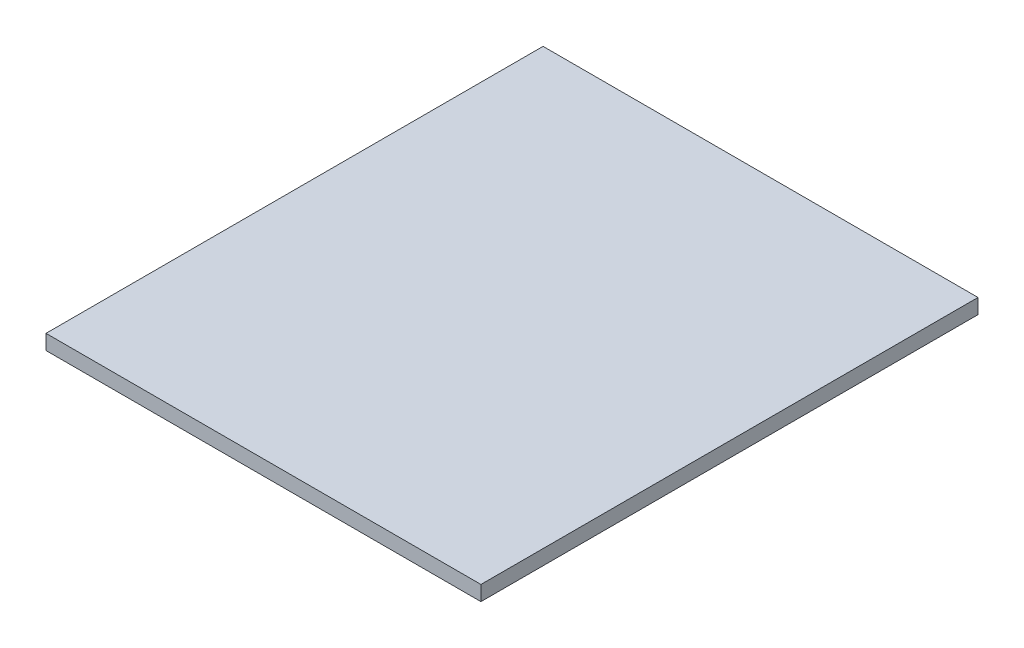
ISO-10303-21;
HEADER;
FILE_DESCRIPTION(('STEP AP214'),'2;1');
FILE_NAME('part.step','',(''),(''),'','','');
FILE_SCHEMA(('AUTOMOTIVE_DESIGN { 1 0 10303 214 1 1 1 1 }'));
ENDSEC;
DATA;
#1=APPLICATION_CONTEXT('core data for automotive mechanical design processes');
#2=APPLICATION_PROTOCOL_DEFINITION('international standard','automotive_design',2000,#1);
#3=PRODUCT_CONTEXT('',#1,'mechanical');
#4=PRODUCT('Part','Part','',(#3));
#5=PRODUCT_RELATED_PRODUCT_CATEGORY('part','',(#4));
#6=PRODUCT_DEFINITION_FORMATION('','',#4);
#7=PRODUCT_DEFINITION_CONTEXT('part definition',#1,'design');
#8=PRODUCT_DEFINITION('design','',#6,#7);
#9=PRODUCT_DEFINITION_SHAPE('','',#8);
#10=(LENGTH_UNIT() NAMED_UNIT(*) SI_UNIT(.MILLI.,.METRE.));
#11=(NAMED_UNIT(*) PLANE_ANGLE_UNIT() SI_UNIT($,.RADIAN.));
#12=(NAMED_UNIT(*) SI_UNIT($,.STERADIAN.) SOLID_ANGLE_UNIT());
#13=UNCERTAINTY_MEASURE_WITH_UNIT(LENGTH_MEASURE(1.E-05),#10,'distance_accuracy_value','');
#14=(GEOMETRIC_REPRESENTATION_CONTEXT(3) GLOBAL_UNCERTAINTY_ASSIGNED_CONTEXT((#13)) GLOBAL_UNIT_ASSIGNED_CONTEXT((#10,
#11,#12)) REPRESENTATION_CONTEXT('',''));
#15=CARTESIAN_POINT('',(0.,0.,0.));
#16=DIRECTION('',(0.,0.,1.));
#17=DIRECTION('',(1.,0.,0.));
#18=AXIS2_PLACEMENT_3D('',#15,#16,#17);
#19=CARTESIAN_POINT('',(-61.2411581593194,24.,-49.6837161639598));
#20=DIRECTION('',(1.,0.,0.));
#21=DIRECTION('',(0.,0.,-1.));
#22=AXIS2_PLACEMENT_3D('',#19,#20,#21);
#23=PLANE('',#22);
#24=DIRECTION('',(0.,0.,1.));
#25=VECTOR('',#24,1.);
#26=CARTESIAN_POINT('',(-61.2411581593194,0.,-49.6837161639598));
#27=LINE('',#26,#25);
#28=CARTESIAN_POINT('',(-61.2411581593194,0.,-49.6837161639598));
#29=VERTEX_POINT('',#28);
#30=CARTESIAN_POINT('',(-61.2411581593193,0.,750.31628383604));
#31=VERTEX_POINT('',#30);
#32=EDGE_CURVE('E95',#29,#31,#27,.T.);
#33=ORIENTED_EDGE('',*,*,#32,.T.);
#34=DIRECTION('',(0.,-1.,0.));
#35=VECTOR('',#34,1.);
#36=CARTESIAN_POINT('',(-61.2411581593193,24.,750.31628383604));
#37=LINE('',#36,#35);
#38=CARTESIAN_POINT('',(-61.2411581593193,24.,750.31628383604));
#39=VERTEX_POINT('',#38);
#40=EDGE_CURVE('E11',#39,#31,#37,.T.);
#41=ORIENTED_EDGE('',*,*,#40,.F.);
#42=DIRECTION('',(0.,0.,1.));
#43=VECTOR('',#42,1.);
#44=CARTESIAN_POINT('',(-61.2411581593194,24.,-49.6837161639598));
#45=LINE('',#44,#43);
#46=CARTESIAN_POINT('',(-61.2411581593194,24.,-49.6837161639598));
#47=VERTEX_POINT('',#46);
#48=EDGE_CURVE('E83',#47,#39,#45,.T.);
#49=ORIENTED_EDGE('',*,*,#48,.F.);
#50=DIRECTION('',(0.,-1.,0.));
#51=VECTOR('',#50,1.);
#52=CARTESIAN_POINT('',(-61.2411581593194,24.,-49.6837161639598));
#53=LINE('',#52,#51);
#54=EDGE_CURVE('E91',#47,#29,#53,.T.);
#55=ORIENTED_EDGE('',*,*,#54,.T.);
#56=EDGE_LOOP('',(#33,#41,#49,#55));
#57=FACE_BOUND('',#56,.T.);
#58=ADVANCED_FACE('F32',(#57),#23,.F.);
#59=CARTESIAN_POINT('',(-61.2411581593193,24.,750.31628383604));
#60=DIRECTION('',(0.,0.,-1.));
#61=DIRECTION('',(-1.,0.,0.));
#62=AXIS2_PLACEMENT_3D('',#59,#60,#61);
#63=PLANE('',#62);
#64=DIRECTION('',(1.,0.,0.));
#65=VECTOR('',#64,1.);
#66=CARTESIAN_POINT('',(-61.2411581593193,0.,750.31628383604));
#67=LINE('',#66,#65);
#68=CARTESIAN_POINT('',(638.758841840681,0.,750.31628383604));
#69=VERTEX_POINT('',#68);
#70=EDGE_CURVE('E87',#31,#69,#67,.T.);
#71=ORIENTED_EDGE('',*,*,#70,.T.);
#72=DIRECTION('',(0.,-1.,0.));
#73=VECTOR('',#72,1.);
#74=CARTESIAN_POINT('',(638.758841840681,24.,750.31628383604));
#75=LINE('',#74,#73);
#76=CARTESIAN_POINT('',(638.758841840681,24.,750.31628383604));
#77=VERTEX_POINT('',#76);
#78=EDGE_CURVE('E40',#77,#69,#75,.T.);
#79=ORIENTED_EDGE('',*,*,#78,.F.);
#80=DIRECTION('',(1.,0.,0.));
#81=VECTOR('',#80,1.);
#82=CARTESIAN_POINT('',(-61.2411581593193,24.,750.31628383604));
#83=LINE('',#82,#81);
#84=EDGE_CURVE('E78',#39,#77,#83,.T.);
#85=ORIENTED_EDGE('',*,*,#84,.F.);
#86=ORIENTED_EDGE('',*,*,#40,.T.);
#87=EDGE_LOOP('',(#71,#79,#85,#86));
#88=FACE_BOUND('',#87,.T.);
#89=ADVANCED_FACE('F86',(#88),#63,.F.);
#90=CARTESIAN_POINT('',(638.758841840681,24.,-49.6837161639598));
#91=DIRECTION('',(-1.,0.,0.));
#92=DIRECTION('',(0.,0.,1.));
#93=AXIS2_PLACEMENT_3D('',#90,#91,#92);
#94=PLANE('',#93);
#95=DIRECTION('',(0.,0.,-1.));
#96=VECTOR('',#95,1.);
#97=CARTESIAN_POINT('',(638.758841840681,0.,-49.6837161639598));
#98=LINE('',#97,#96);
#99=CARTESIAN_POINT('',(638.758841840681,0.,-49.6837161639598));
#100=VERTEX_POINT('',#99);
#101=EDGE_CURVE('E65',#69,#100,#98,.T.);
#102=ORIENTED_EDGE('',*,*,#101,.T.);
#103=DIRECTION('',(0.,-1.,0.));
#104=VECTOR('',#103,1.);
#105=CARTESIAN_POINT('',(638.758841840681,24.,-49.6837161639598));
#106=LINE('',#105,#104);
#107=CARTESIAN_POINT('',(638.758841840681,24.,-49.6837161639598));
#108=VERTEX_POINT('',#107);
#109=EDGE_CURVE('E88',#108,#100,#106,.T.);
#110=ORIENTED_EDGE('',*,*,#109,.F.);
#111=DIRECTION('',(0.,0.,-1.));
#112=VECTOR('',#111,1.);
#113=CARTESIAN_POINT('',(638.758841840681,24.,-49.6837161639598));
#114=LINE('',#113,#112);
#115=EDGE_CURVE('E81',#77,#108,#114,.T.);
#116=ORIENTED_EDGE('',*,*,#115,.F.);
#117=ORIENTED_EDGE('',*,*,#78,.T.);
#118=EDGE_LOOP('',(#102,#110,#116,#117));
#119=FACE_BOUND('',#118,.T.);
#120=ADVANCED_FACE('F89',(#119),#94,.F.);
#121=CARTESIAN_POINT('',(-61.2411581593194,24.,-49.6837161639598));
#122=DIRECTION('',(0.,0.,1.));
#123=DIRECTION('',(1.,0.,0.));
#124=AXIS2_PLACEMENT_3D('',#121,#122,#123);
#125=PLANE('',#124);
#126=DIRECTION('',(-1.,0.,0.));
#127=VECTOR('',#126,1.);
#128=CARTESIAN_POINT('',(-61.2411581593194,0.,-49.6837161639598));
#129=LINE('',#128,#127);
#130=EDGE_CURVE('E71',#100,#29,#129,.T.);
#131=ORIENTED_EDGE('',*,*,#130,.T.);
#132=ORIENTED_EDGE('',*,*,#54,.F.);
#133=DIRECTION('',(-1.,0.,0.));
#134=VECTOR('',#133,1.);
#135=CARTESIAN_POINT('',(-61.2411581593194,24.,-49.6837161639598));
#136=LINE('',#135,#134);
#137=EDGE_CURVE('E48',#108,#47,#136,.T.);
#138=ORIENTED_EDGE('',*,*,#137,.F.);
#139=ORIENTED_EDGE('',*,*,#109,.T.);
#140=EDGE_LOOP('',(#131,#132,#138,#139));
#141=FACE_BOUND('',#140,.T.);
#142=ADVANCED_FACE('F102',(#141),#125,.F.);
#143=CARTESIAN_POINT('',(0.,24.,0.));
#144=DIRECTION('',(0.,1.,0.));
#145=DIRECTION('',(0.,0.,1.));
#146=AXIS2_PLACEMENT_3D('',#143,#144,#145);
#147=PLANE('',#146);
#148=ORIENTED_EDGE('',*,*,#48,.T.);
#149=ORIENTED_EDGE('',*,*,#84,.T.);
#150=ORIENTED_EDGE('',*,*,#115,.T.);
#151=ORIENTED_EDGE('',*,*,#137,.T.);
#152=EDGE_LOOP('',(#148,#149,#150,#151));
#153=FACE_BOUND('',#152,.T.);
#154=ADVANCED_FACE('F79',(#153),#147,.T.);
#155=CARTESIAN_POINT('',(0.,0.,0.));
#156=DIRECTION('',(0.,1.,0.));
#157=DIRECTION('',(0.,0.,1.));
#158=AXIS2_PLACEMENT_3D('',#155,#156,#157);
#159=PLANE('',#158);
#160=ORIENTED_EDGE('',*,*,#32,.F.);
#161=ORIENTED_EDGE('',*,*,#130,.F.);
#162=ORIENTED_EDGE('',*,*,#101,.F.);
#163=ORIENTED_EDGE('',*,*,#70,.F.);
#164=EDGE_LOOP('',(#160,#161,#162,#163));
#165=FACE_BOUND('',#164,.T.);
#166=ADVANCED_FACE('F105',(#165),#159,.F.);
#167=CLOSED_SHELL('',(#58,#89,#120,#142,#154,#166));
#168=MANIFOLD_SOLID_BREP('B2',#167);
#169=ADVANCED_BREP_SHAPE_REPRESENTATION('',(#18,#168),#14);
#170=SHAPE_DEFINITION_REPRESENTATION(#9,#169);
ENDSEC;
END-ISO-10303-21;
